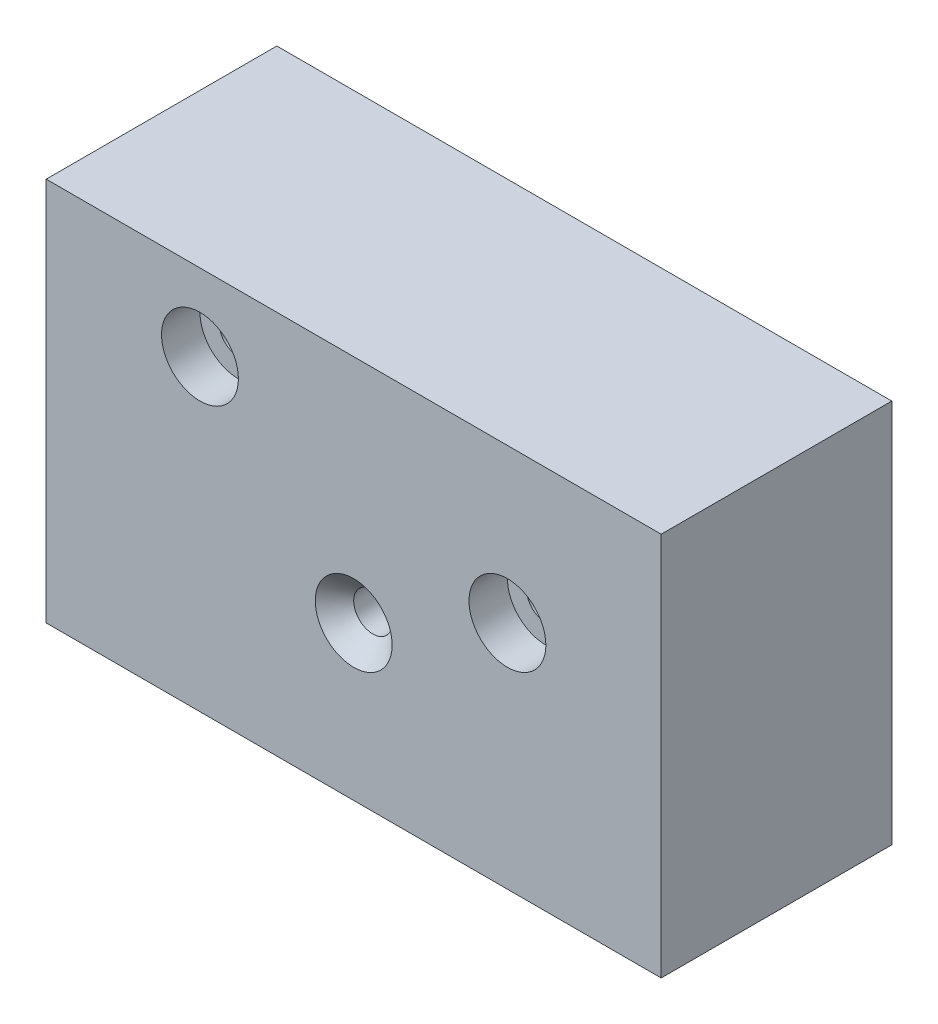
ISO-10303-21;
HEADER;
FILE_DESCRIPTION(('STEP AP214'),'2;1');
FILE_NAME('part.step','',(''),(''),'','','');
FILE_SCHEMA(('AUTOMOTIVE_DESIGN { 1 0 10303 214 1 1 1 1 }'));
ENDSEC;
DATA;
#1=APPLICATION_CONTEXT('core data for automotive mechanical design processes');
#2=APPLICATION_PROTOCOL_DEFINITION('international standard','automotive_design',2000,#1);
#3=PRODUCT_CONTEXT('',#1,'mechanical');
#4=PRODUCT('Part','Part','',(#3));
#5=PRODUCT_RELATED_PRODUCT_CATEGORY('part','',(#4));
#6=PRODUCT_DEFINITION_FORMATION('','',#4);
#7=PRODUCT_DEFINITION_CONTEXT('part definition',#1,'design');
#8=PRODUCT_DEFINITION('design','',#6,#7);
#9=PRODUCT_DEFINITION_SHAPE('','',#8);
#10=(LENGTH_UNIT() NAMED_UNIT(*) SI_UNIT(.MILLI.,.METRE.));
#11=(NAMED_UNIT(*) PLANE_ANGLE_UNIT() SI_UNIT($,.RADIAN.));
#12=(NAMED_UNIT(*) SI_UNIT($,.STERADIAN.) SOLID_ANGLE_UNIT());
#13=UNCERTAINTY_MEASURE_WITH_UNIT(LENGTH_MEASURE(1.E-05),#10,'distance_accuracy_value','');
#14=(GEOMETRIC_REPRESENTATION_CONTEXT(3) GLOBAL_UNCERTAINTY_ASSIGNED_CONTEXT((#13)) GLOBAL_UNIT_ASSIGNED_CONTEXT((#10,
#11,#12)) REPRESENTATION_CONTEXT('',''));
#15=CARTESIAN_POINT('',(0.,0.,0.));
#16=DIRECTION('',(0.,0.,1.));
#17=DIRECTION('',(1.,0.,0.));
#18=AXIS2_PLACEMENT_3D('',#15,#16,#17);
#19=CARTESIAN_POINT('',(-49.3939393939394,22.2727272727273,30.));
#20=DIRECTION('',(1.,0.,0.));
#21=DIRECTION('',(0.,1.,0.));
#22=AXIS2_PLACEMENT_3D('',#19,#20,#21);
#23=PLANE('',#22);
#24=DIRECTION('',(0.,-1.,0.));
#25=VECTOR('',#24,1.);
#26=CARTESIAN_POINT('',(-49.3939393939394,22.2727272727273,0.));
#27=LINE('',#26,#25);
#28=CARTESIAN_POINT('',(-49.3939393939394,22.2727272727273,0.));
#29=VERTEX_POINT('',#28);
#30=CARTESIAN_POINT('',(-49.3939393939394,-27.7272727272727,0.));
#31=VERTEX_POINT('',#30);
#32=EDGE_CURVE('E107',#29,#31,#27,.T.);
#33=ORIENTED_EDGE('',*,*,#32,.T.);
#34=DIRECTION('',(0.,0.,-1.));
#35=VECTOR('',#34,1.);
#36=CARTESIAN_POINT('',(-49.3939393939394,-27.7272727272727,30.));
#37=LINE('',#36,#35);
#38=CARTESIAN_POINT('',(-49.3939393939394,-27.7272727272727,30.));
#39=VERTEX_POINT('',#38);
#40=EDGE_CURVE('E11',#39,#31,#37,.T.);
#41=ORIENTED_EDGE('',*,*,#40,.F.);
#42=DIRECTION('',(0.,-1.,0.));
#43=VECTOR('',#42,1.);
#44=CARTESIAN_POINT('',(-49.3939393939394,22.2727272727273,30.));
#45=LINE('',#44,#43);
#46=CARTESIAN_POINT('',(-49.3939393939394,22.2727272727273,30.));
#47=VERTEX_POINT('',#46);
#48=EDGE_CURVE('E91',#47,#39,#45,.T.);
#49=ORIENTED_EDGE('',*,*,#48,.F.);
#50=DIRECTION('',(0.,0.,-1.));
#51=VECTOR('',#50,1.);
#52=CARTESIAN_POINT('',(-49.3939393939394,22.2727272727273,30.));
#53=LINE('',#52,#51);
#54=EDGE_CURVE('E103',#47,#29,#53,.T.);
#55=ORIENTED_EDGE('',*,*,#54,.T.);
#56=EDGE_LOOP('',(#33,#41,#49,#55));
#57=FACE_BOUND('',#56,.T.);
#58=ADVANCED_FACE('F39',(#57),#23,.F.);
#59=CARTESIAN_POINT('',(-49.3939393939394,-27.7272727272727,30.));
#60=DIRECTION('',(0.,1.,0.));
#61=DIRECTION('',(0.,0.,1.));
#62=AXIS2_PLACEMENT_3D('',#59,#60,#61);
#63=PLANE('',#62);
#64=DIRECTION('',(1.,0.,0.));
#65=VECTOR('',#64,1.);
#66=CARTESIAN_POINT('',(-49.3939393939394,-27.7272727272727,0.));
#67=LINE('',#66,#65);
#68=CARTESIAN_POINT('',(30.6060606060606,-27.7272727272727,0.));
#69=VERTEX_POINT('',#68);
#70=EDGE_CURVE('E96',#31,#69,#67,.T.);
#71=ORIENTED_EDGE('',*,*,#70,.T.);
#72=DIRECTION('',(0.,0.,-1.));
#73=VECTOR('',#72,1.);
#74=CARTESIAN_POINT('',(30.6060606060606,-27.7272727272727,30.));
#75=LINE('',#74,#73);
#76=CARTESIAN_POINT('',(30.6060606060606,-27.7272727272727,30.));
#77=VERTEX_POINT('',#76);
#78=EDGE_CURVE('E48',#77,#69,#75,.T.);
#79=ORIENTED_EDGE('',*,*,#78,.F.);
#80=DIRECTION('',(1.,0.,0.));
#81=VECTOR('',#80,1.);
#82=CARTESIAN_POINT('',(-49.3939393939394,-27.7272727272727,30.));
#83=LINE('',#82,#81);
#84=EDGE_CURVE('E86',#39,#77,#83,.T.);
#85=ORIENTED_EDGE('',*,*,#84,.F.);
#86=ORIENTED_EDGE('',*,*,#40,.T.);
#87=EDGE_LOOP('',(#71,#79,#85,#86));
#88=FACE_BOUND('',#87,.T.);
#89=ADVANCED_FACE('F95',(#88),#63,.F.);
#90=CARTESIAN_POINT('',(30.6060606060606,22.2727272727273,30.));
#91=DIRECTION('',(-1.,0.,0.));
#92=DIRECTION('',(0.,-1.,0.));
#93=AXIS2_PLACEMENT_3D('',#90,#91,#92);
#94=PLANE('',#93);
#95=DIRECTION('',(0.,1.,0.));
#96=VECTOR('',#95,1.);
#97=CARTESIAN_POINT('',(30.6060606060606,22.2727272727273,0.));
#98=LINE('',#97,#96);
#99=CARTESIAN_POINT('',(30.6060606060606,22.2727272727273,0.));
#100=VERTEX_POINT('',#99);
#101=EDGE_CURVE('E73',#69,#100,#98,.T.);
#102=ORIENTED_EDGE('',*,*,#101,.T.);
#103=DIRECTION('',(0.,0.,-1.));
#104=VECTOR('',#103,1.);
#105=CARTESIAN_POINT('',(30.6060606060606,22.2727272727273,30.));
#106=LINE('',#105,#104);
#107=CARTESIAN_POINT('',(30.6060606060606,22.2727272727273,30.));
#108=VERTEX_POINT('',#107);
#109=EDGE_CURVE('E98',#108,#100,#106,.T.);
#110=ORIENTED_EDGE('',*,*,#109,.F.);
#111=DIRECTION('',(0.,1.,0.));
#112=VECTOR('',#111,1.);
#113=CARTESIAN_POINT('',(30.6060606060606,22.2727272727273,30.));
#114=LINE('',#113,#112);
#115=EDGE_CURVE('E89',#77,#108,#114,.T.);
#116=ORIENTED_EDGE('',*,*,#115,.F.);
#117=ORIENTED_EDGE('',*,*,#78,.T.);
#118=EDGE_LOOP('',(#102,#110,#116,#117));
#119=FACE_BOUND('',#118,.T.);
#120=ADVANCED_FACE('F99',(#119),#94,.F.);
#121=CARTESIAN_POINT('',(-49.3939393939394,22.2727272727273,30.));
#122=DIRECTION('',(0.,-1.,0.));
#123=DIRECTION('',(0.,0.,-1.));
#124=AXIS2_PLACEMENT_3D('',#121,#122,#123);
#125=PLANE('',#124);
#126=DIRECTION('',(-1.,0.,0.));
#127=VECTOR('',#126,1.);
#128=CARTESIAN_POINT('',(-49.3939393939394,22.2727272727273,0.));
#129=LINE('',#128,#127);
#130=EDGE_CURVE('E79',#100,#29,#129,.T.);
#131=ORIENTED_EDGE('',*,*,#130,.T.);
#132=ORIENTED_EDGE('',*,*,#54,.F.);
#133=DIRECTION('',(-1.,0.,0.));
#134=VECTOR('',#133,1.);
#135=CARTESIAN_POINT('',(-49.3939393939394,22.2727272727273,30.));
#136=LINE('',#135,#134);
#137=EDGE_CURVE('E56',#108,#47,#136,.T.);
#138=ORIENTED_EDGE('',*,*,#137,.F.);
#139=ORIENTED_EDGE('',*,*,#109,.T.);
#140=EDGE_LOOP('',(#131,#132,#138,#139));
#141=FACE_BOUND('',#140,.T.);
#142=ADVANCED_FACE('F121',(#141),#125,.F.);
#143=CARTESIAN_POINT('',(0.,0.,30.));
#144=DIRECTION('',(0.,0.,1.));
#145=DIRECTION('',(1.,0.,0.));
#146=AXIS2_PLACEMENT_3D('',#143,#144,#145);
#147=PLANE('',#146);
#148=CARTESIAN_POINT('',(-9.39393939393938,-7.72727272727273,30.));
#149=DIRECTION('',(0.,0.,1.));
#150=DIRECTION('',(1.,0.,0.));
#151=AXIS2_PLACEMENT_3D('',#148,#149,#150);
#152=CIRCLE('',#151,5.);
#153=CARTESIAN_POINT('',(-4.39393939393938,-7.72727272727273,30.));
#154=VERTEX_POINT('',#153);
#155=EDGE_CURVE('E167',#154,#154,#152,.T.);
#156=ORIENTED_EDGE('',*,*,#155,.F.);
#157=EDGE_LOOP('',(#156));
#158=FACE_BOUND('',#157,.T.);
#159=CARTESIAN_POINT('',(10.6060606060606,2.27272727272727,30.));
#160=DIRECTION('',(0.,0.,1.));
#161=DIRECTION('',(1.,0.,0.));
#162=AXIS2_PLACEMENT_3D('',#159,#160,#161);
#163=CIRCLE('',#162,4.99999999999999);
#164=CARTESIAN_POINT('',(15.6060606060606,2.27272727272727,30.));
#165=VERTEX_POINT('',#164);
#166=EDGE_CURVE('E155',#165,#165,#163,.T.);
#167=ORIENTED_EDGE('',*,*,#166,.F.);
#168=EDGE_LOOP('',(#167));
#169=FACE_BOUND('',#168,.T.);
#170=CARTESIAN_POINT('',(-29.3939393939394,12.2727272727273,30.));
#171=DIRECTION('',(0.,0.,1.));
#172=DIRECTION('',(1.,0.,0.));
#173=AXIS2_PLACEMENT_3D('',#170,#171,#172);
#174=CIRCLE('',#173,5.);
#175=CARTESIAN_POINT('',(-24.3939393939394,12.2727272727273,30.));
#176=VERTEX_POINT('',#175);
#177=EDGE_CURVE('E139',#176,#176,#174,.T.);
#178=ORIENTED_EDGE('',*,*,#177,.F.);
#179=EDGE_LOOP('',(#178));
#180=FACE_BOUND('',#179,.T.);
#181=ORIENTED_EDGE('',*,*,#48,.T.);
#182=ORIENTED_EDGE('',*,*,#84,.T.);
#183=ORIENTED_EDGE('',*,*,#115,.T.);
#184=ORIENTED_EDGE('',*,*,#137,.T.);
#185=EDGE_LOOP('',(#181,#182,#183,#184));
#186=FACE_BOUND('',#185,.T.);
#187=ADVANCED_FACE('F87',(#158,#169,#180,#186),#147,.T.);
#188=CARTESIAN_POINT('',(0.,0.,0.));
#189=DIRECTION('',(0.,0.,1.));
#190=DIRECTION('',(1.,0.,0.));
#191=AXIS2_PLACEMENT_3D('',#188,#189,#190);
#192=PLANE('',#191);
#193=CARTESIAN_POINT('',(-9.39393939393938,-7.72727272727273,0.));
#194=DIRECTION('',(0.,0.,1.));
#195=DIRECTION('',(1.,0.,0.));
#196=AXIS2_PLACEMENT_3D('',#193,#194,#195);
#197=CIRCLE('',#196,2.5);
#198=CARTESIAN_POINT('',(-6.89393939393938,-7.72727272727273,0.));
#199=VERTEX_POINT('',#198);
#200=EDGE_CURVE('E159',#199,#199,#197,.T.);
#201=ORIENTED_EDGE('',*,*,#200,.T.);
#202=EDGE_LOOP('',(#201));
#203=FACE_BOUND('',#202,.T.);
#204=CARTESIAN_POINT('',(10.6060606060606,2.27272727272727,0.));
#205=DIRECTION('',(0.,0.,1.));
#206=DIRECTION('',(1.,0.,0.));
#207=AXIS2_PLACEMENT_3D('',#204,#205,#206);
#208=CIRCLE('',#207,2.49999999999999);
#209=CARTESIAN_POINT('',(13.1060606060606,2.27272727272727,0.));
#210=VERTEX_POINT('',#209);
#211=EDGE_CURVE('E143',#210,#210,#208,.T.);
#212=ORIENTED_EDGE('',*,*,#211,.T.);
#213=EDGE_LOOP('',(#212));
#214=FACE_BOUND('',#213,.T.);
#215=CARTESIAN_POINT('',(-29.3939393939394,12.2727272727273,0.));
#216=DIRECTION('',(0.,0.,1.));
#217=DIRECTION('',(1.,0.,0.));
#218=AXIS2_PLACEMENT_3D('',#215,#216,#217);
#219=CIRCLE('',#218,2.49999999999999);
#220=CARTESIAN_POINT('',(-26.8939393939394,12.2727272727273,0.));
#221=VERTEX_POINT('',#220);
#222=EDGE_CURVE('E111',#221,#221,#219,.T.);
#223=ORIENTED_EDGE('',*,*,#222,.T.);
#224=EDGE_LOOP('',(#223));
#225=FACE_BOUND('',#224,.T.);
#226=ORIENTED_EDGE('',*,*,#32,.F.);
#227=ORIENTED_EDGE('',*,*,#130,.F.);
#228=ORIENTED_EDGE('',*,*,#101,.F.);
#229=ORIENTED_EDGE('',*,*,#70,.F.);
#230=EDGE_LOOP('',(#226,#227,#228,#229));
#231=FACE_BOUND('',#230,.T.);
#232=ADVANCED_FACE('F124',(#203,#214,#225,#231),#192,.F.);
#233=CARTESIAN_POINT('',(-29.3939393939394,12.2727272727273,30.));
#234=DIRECTION('',(0.,0.,1.));
#235=DIRECTION('',(1.,0.,0.));
#236=AXIS2_PLACEMENT_3D('',#233,#234,#235);
#237=CYLINDRICAL_SURFACE('',#236,2.5);
#238=ORIENTED_EDGE('',*,*,#222,.F.);
#239=EDGE_LOOP('',(#238));
#240=FACE_BOUND('',#239,.T.);
#241=CARTESIAN_POINT('',(-29.3939393939394,12.2727272727273,25.));
#242=DIRECTION('',(0.,0.,1.));
#243=DIRECTION('',(1.,0.,0.));
#244=AXIS2_PLACEMENT_3D('',#241,#242,#243);
#245=CIRCLE('',#244,2.5);
#246=CARTESIAN_POINT('',(-26.8939393939394,12.2727272727273,25.));
#247=VERTEX_POINT('',#246);
#248=EDGE_CURVE('E131',#247,#247,#245,.T.);
#249=ORIENTED_EDGE('',*,*,#248,.T.);
#250=EDGE_LOOP('',(#249));
#251=FACE_BOUND('',#250,.T.);
#252=ADVANCED_FACE('F194',(#240,#251),#237,.F.);
#253=CARTESIAN_POINT('',(-26.8939393939394,12.2727272727273,25.));
#254=DIRECTION('',(0.,0.,-1.));
#255=DIRECTION('',(-1.,0.,0.));
#256=AXIS2_PLACEMENT_3D('',#253,#254,#255);
#257=PLANE('',#256);
#258=ORIENTED_EDGE('',*,*,#248,.F.);
#259=EDGE_LOOP('',(#258));
#260=FACE_BOUND('',#259,.T.);
#261=CARTESIAN_POINT('',(-29.3939393939394,12.2727272727273,25.));
#262=DIRECTION('',(0.,0.,1.));
#263=DIRECTION('',(1.,0.,0.));
#264=AXIS2_PLACEMENT_3D('',#261,#262,#263);
#265=CIRCLE('',#264,5.);
#266=CARTESIAN_POINT('',(-24.3939393939394,12.2727272727273,25.));
#267=VERTEX_POINT('',#266);
#268=EDGE_CURVE('E135',#267,#267,#265,.T.);
#269=ORIENTED_EDGE('',*,*,#268,.T.);
#270=EDGE_LOOP('',(#269));
#271=FACE_BOUND('',#270,.T.);
#272=ADVANCED_FACE('F184',(#260,#271),#257,.F.);
#273=CARTESIAN_POINT('',(-29.3939393939394,12.2727272727273,30.));
#274=DIRECTION('',(0.,0.,1.));
#275=DIRECTION('',(1.,0.,0.));
#276=AXIS2_PLACEMENT_3D('',#273,#274,#275);
#277=CYLINDRICAL_SURFACE('',#276,5.);
#278=ORIENTED_EDGE('',*,*,#268,.F.);
#279=EDGE_LOOP('',(#278));
#280=FACE_BOUND('',#279,.T.);
#281=ORIENTED_EDGE('',*,*,#177,.T.);
#282=EDGE_LOOP('',(#281));
#283=FACE_BOUND('',#282,.T.);
#284=ADVANCED_FACE('F181',(#280,#283),#277,.F.);
#285=CARTESIAN_POINT('',(10.6060606060606,2.27272727272727,30.));
#286=DIRECTION('',(0.,0.,1.));
#287=DIRECTION('',(1.,0.,0.));
#288=AXIS2_PLACEMENT_3D('',#285,#286,#287);
#289=CYLINDRICAL_SURFACE('',#288,2.5);
#290=ORIENTED_EDGE('',*,*,#211,.F.);
#291=EDGE_LOOP('',(#290));
#292=FACE_BOUND('',#291,.T.);
#293=CARTESIAN_POINT('',(10.6060606060606,2.27272727272727,25.));
#294=DIRECTION('',(0.,0.,1.));
#295=DIRECTION('',(1.,0.,0.));
#296=AXIS2_PLACEMENT_3D('',#293,#294,#295);
#297=CIRCLE('',#296,2.5);
#298=CARTESIAN_POINT('',(13.1060606060606,2.27272727272727,25.));
#299=VERTEX_POINT('',#298);
#300=EDGE_CURVE('E147',#299,#299,#297,.T.);
#301=ORIENTED_EDGE('',*,*,#300,.T.);
#302=EDGE_LOOP('',(#301));
#303=FACE_BOUND('',#302,.T.);
#304=ADVANCED_FACE('F183',(#292,#303),#289,.F.);
#305=CARTESIAN_POINT('',(13.1060606060606,2.27272727272727,25.));
#306=DIRECTION('',(0.,0.,-1.));
#307=DIRECTION('',(-1.,0.,0.));
#308=AXIS2_PLACEMENT_3D('',#305,#306,#307);
#309=PLANE('',#308);
#310=ORIENTED_EDGE('',*,*,#300,.F.);
#311=EDGE_LOOP('',(#310));
#312=FACE_BOUND('',#311,.T.);
#313=CARTESIAN_POINT('',(10.6060606060606,2.27272727272727,25.));
#314=DIRECTION('',(0.,0.,1.));
#315=DIRECTION('',(1.,0.,0.));
#316=AXIS2_PLACEMENT_3D('',#313,#314,#315);
#317=CIRCLE('',#316,5.);
#318=CARTESIAN_POINT('',(15.6060606060606,2.27272727272727,25.));
#319=VERTEX_POINT('',#318);
#320=EDGE_CURVE('E151',#319,#319,#317,.T.);
#321=ORIENTED_EDGE('',*,*,#320,.T.);
#322=EDGE_LOOP('',(#321));
#323=FACE_BOUND('',#322,.T.);
#324=ADVANCED_FACE('F191',(#312,#323),#309,.F.);
#325=CARTESIAN_POINT('',(10.6060606060606,2.27272727272727,30.));
#326=DIRECTION('',(0.,0.,1.));
#327=DIRECTION('',(1.,0.,0.));
#328=AXIS2_PLACEMENT_3D('',#325,#326,#327);
#329=CYLINDRICAL_SURFACE('',#328,5.);
#330=ORIENTED_EDGE('',*,*,#320,.F.);
#331=EDGE_LOOP('',(#330));
#332=FACE_BOUND('',#331,.T.);
#333=ORIENTED_EDGE('',*,*,#166,.T.);
#334=EDGE_LOOP('',(#333));
#335=FACE_BOUND('',#334,.T.);
#336=ADVANCED_FACE('F247',(#332,#335),#329,.F.);
#337=CARTESIAN_POINT('',(-9.39393939393938,-7.72727272727273,30.));
#338=DIRECTION('',(0.,0.,1.));
#339=DIRECTION('',(1.,0.,0.));
#340=AXIS2_PLACEMENT_3D('',#337,#338,#339);
#341=CYLINDRICAL_SURFACE('',#340,2.5);
#342=ORIENTED_EDGE('',*,*,#200,.F.);
#343=EDGE_LOOP('',(#342));
#344=FACE_BOUND('',#343,.T.);
#345=CARTESIAN_POINT('',(-9.39393939393938,-7.72727272727273,27.5));
#346=DIRECTION('',(0.,0.,1.));
#347=DIRECTION('',(1.,0.,0.));
#348=AXIS2_PLACEMENT_3D('',#345,#346,#347);
#349=CIRCLE('',#348,2.5);
#350=CARTESIAN_POINT('',(-6.89393939393938,-7.72727272727273,27.5));
#351=VERTEX_POINT('',#350);
#352=EDGE_CURVE('E163',#351,#351,#349,.T.);
#353=ORIENTED_EDGE('',*,*,#352,.T.);
#354=EDGE_LOOP('',(#353));
#355=FACE_BOUND('',#354,.T.);
#356=ADVANCED_FACE('F257',(#344,#355),#341,.F.);
#357=CARTESIAN_POINT('',(-9.39393939393938,-7.72727272727273,30.));
#358=DIRECTION('',(0.,0.,1.));
#359=DIRECTION('',(1.,0.,0.));
#360=AXIS2_PLACEMENT_3D('',#357,#358,#359);
#361=CONICAL_SURFACE('',#360,5.,0.785398163397449);
#362=ORIENTED_EDGE('',*,*,#352,.F.);
#363=EDGE_LOOP('',(#362));
#364=FACE_BOUND('',#363,.T.);
#365=ORIENTED_EDGE('',*,*,#155,.T.);
#366=EDGE_LOOP('',(#365));
#367=FACE_BOUND('',#366,.T.);
#368=ADVANCED_FACE('F172',(#364,#367),#361,.F.);
#369=CLOSED_SHELL('',(#58,#89,#120,#142,#187,#232,#252,#272,#284,#304,#324,#336,#356,#368));
#370=MANIFOLD_SOLID_BREP('B2',#369);
#371=ADVANCED_BREP_SHAPE_REPRESENTATION('',(#18,#370),#14);
#372=SHAPE_DEFINITION_REPRESENTATION(#9,#371);
ENDSEC;
END-ISO-10303-21;
